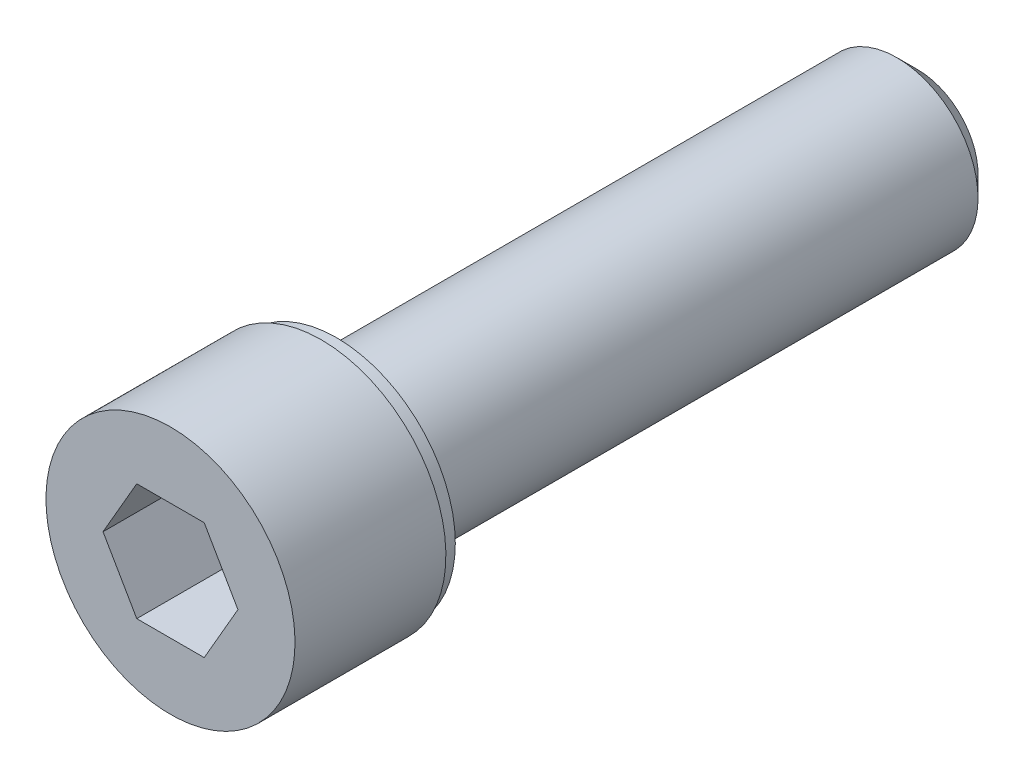
ISO-10303-21;
HEADER;
FILE_DESCRIPTION(('STEP AP214'),'2;1');
FILE_NAME('part.step','',(''),(''),'','','');
FILE_SCHEMA(('AUTOMOTIVE_DESIGN { 1 0 10303 214 1 1 1 1 }'));
ENDSEC;
DATA;
#1=APPLICATION_CONTEXT('core data for automotive mechanical design processes');
#2=APPLICATION_PROTOCOL_DEFINITION('international standard','automotive_design',2000,#1);
#3=PRODUCT_CONTEXT('',#1,'mechanical');
#4=PRODUCT('Part','Part','',(#3));
#5=PRODUCT_RELATED_PRODUCT_CATEGORY('part','',(#4));
#6=PRODUCT_DEFINITION_FORMATION('','',#4);
#7=PRODUCT_DEFINITION_CONTEXT('part definition',#1,'design');
#8=PRODUCT_DEFINITION('design','',#6,#7);
#9=PRODUCT_DEFINITION_SHAPE('','',#8);
#10=(LENGTH_UNIT() NAMED_UNIT(*) SI_UNIT(.MILLI.,.METRE.));
#11=(NAMED_UNIT(*) PLANE_ANGLE_UNIT() SI_UNIT($,.RADIAN.));
#12=(NAMED_UNIT(*) SI_UNIT($,.STERADIAN.) SOLID_ANGLE_UNIT());
#13=UNCERTAINTY_MEASURE_WITH_UNIT(LENGTH_MEASURE(1.E-05),#10,'distance_accuracy_value','');
#14=(GEOMETRIC_REPRESENTATION_CONTEXT(3) GLOBAL_UNCERTAINTY_ASSIGNED_CONTEXT((#13)) GLOBAL_UNIT_ASSIGNED_CONTEXT((#10,
#11,#12)) REPRESENTATION_CONTEXT('',''));
#15=CARTESIAN_POINT('',(0.,0.,0.));
#16=DIRECTION('',(0.,0.,1.));
#17=DIRECTION('',(1.,0.,0.));
#18=AXIS2_PLACEMENT_3D('',#15,#16,#17);
#19=CARTESIAN_POINT('',(0.,0.,0.));
#20=DIRECTION('',(0.,0.,1.));
#21=DIRECTION('',(0.,-1.,0.));
#22=AXIS2_PLACEMENT_3D('',#19,#20,#21);
#23=PLANE('',#22);
#24=DIRECTION('',(-0.5,-0.866025403784439,0.));
#25=VECTOR('',#24,1.);
#26=CARTESIAN_POINT('',(-0.812499999999999,1.40729128114971,0.));
#27=LINE('',#26,#25);
#28=CARTESIAN_POINT('',(-0.812499999999999,1.40729128114971,0.));
#29=VERTEX_POINT('',#28);
#30=CARTESIAN_POINT('',(-1.625,0.,0.));
#31=VERTEX_POINT('',#30);
#32=EDGE_CURVE('E49',#29,#31,#27,.T.);
#33=ORIENTED_EDGE('',*,*,#32,.F.);
#34=DIRECTION('',(-1.,0.,0.));
#35=VECTOR('',#34,1.);
#36=CARTESIAN_POINT('',(0.812499999999999,1.40729128114971,0.));
#37=LINE('',#36,#35);
#38=CARTESIAN_POINT('',(0.812499999999999,1.40729128114971,0.));
#39=VERTEX_POINT('',#38);
#40=EDGE_CURVE('E132',#39,#29,#37,.T.);
#41=ORIENTED_EDGE('',*,*,#40,.F.);
#42=DIRECTION('',(-0.5,0.866025403784439,0.));
#43=VECTOR('',#42,1.);
#44=CARTESIAN_POINT('',(1.625,0.,0.));
#45=LINE('',#44,#43);
#46=CARTESIAN_POINT('',(1.625,0.,0.));
#47=VERTEX_POINT('',#46);
#48=EDGE_CURVE('E130',#47,#39,#45,.T.);
#49=ORIENTED_EDGE('',*,*,#48,.F.);
#50=DIRECTION('',(0.5,0.866025403784439,0.));
#51=VECTOR('',#50,1.);
#52=CARTESIAN_POINT('',(0.8125,-1.40729128114971,0.));
#53=LINE('',#52,#51);
#54=CARTESIAN_POINT('',(0.8125,-1.40729128114971,0.));
#55=VERTEX_POINT('',#54);
#56=EDGE_CURVE('E97',#55,#47,#53,.T.);
#57=ORIENTED_EDGE('',*,*,#56,.F.);
#58=DIRECTION('',(1.,0.,0.));
#59=VECTOR('',#58,1.);
#60=CARTESIAN_POINT('',(-0.812500000000001,-1.40729128114971,0.));
#61=LINE('',#60,#59);
#62=CARTESIAN_POINT('',(-0.812500000000001,-1.40729128114971,0.));
#63=VERTEX_POINT('',#62);
#64=EDGE_CURVE('E126',#63,#55,#61,.T.);
#65=ORIENTED_EDGE('',*,*,#64,.F.);
#66=DIRECTION('',(0.5,-0.866025403784439,0.));
#67=VECTOR('',#66,1.);
#68=CARTESIAN_POINT('',(-1.625,0.,0.));
#69=LINE('',#68,#67);
#70=EDGE_CURVE('E123',#31,#63,#69,.T.);
#71=ORIENTED_EDGE('',*,*,#70,.F.);
#72=EDGE_LOOP('',(#33,#41,#49,#57,#65,#71));
#73=FACE_BOUND('',#72,.T.);
#74=CARTESIAN_POINT('',(0.,0.,0.));
#75=DIRECTION('',(0.,0.,-1.));
#76=DIRECTION('',(0.,1.,0.));
#77=AXIS2_PLACEMENT_3D('',#74,#75,#76);
#78=CIRCLE('',#77,3.00000000000011);
#79=CARTESIAN_POINT('',(0.,3.00000000000011,0.));
#80=VERTEX_POINT('',#79);
#81=EDGE_CURVE('E150',#80,#80,#78,.T.);
#82=ORIENTED_EDGE('',*,*,#81,.F.);
#83=EDGE_LOOP('',(#82));
#84=FACE_BOUND('',#83,.T.);
#85=ADVANCED_FACE('F34',(#73,#84),#23,.T.);
#86=CARTESIAN_POINT('',(0.,0.,-18.));
#87=DIRECTION('',(0.,0.,-1.));
#88=DIRECTION('',(0.,1.,0.));
#89=AXIS2_PLACEMENT_3D('',#86,#87,#88);
#90=CYLINDRICAL_SURFACE('',#89,3.00000000000012);
#91=ORIENTED_EDGE('',*,*,#81,.T.);
#92=EDGE_LOOP('',(#91));
#93=FACE_BOUND('',#92,.T.);
#94=CARTESIAN_POINT('',(0.,0.,-3.63504566037622));
#95=DIRECTION('',(0.,0.,-1.));
#96=DIRECTION('',(0.,1.,0.));
#97=AXIS2_PLACEMENT_3D('',#94,#95,#96);
#98=CIRCLE('',#97,3.00000000000012);
#99=CARTESIAN_POINT('',(0.,3.00000000000011,-3.63504566037623));
#100=VERTEX_POINT('',#99);
#101=EDGE_CURVE('E147',#100,#100,#98,.T.);
#102=ORIENTED_EDGE('',*,*,#101,.F.);
#103=EDGE_LOOP('',(#102));
#104=FACE_BOUND('',#103,.T.);
#105=ADVANCED_FACE('F176',(#93,#104),#90,.T.);
#106=CARTESIAN_POINT('',(0.,3.00000000000011,-3.63504566037623));
#107=DIRECTION('',(0.,0.,-1.));
#108=DIRECTION('',(0.,1.,0.));
#109=AXIS2_PLACEMENT_3D('',#106,#107,#108);
#110=PLANE('',#109);
#111=ORIENTED_EDGE('',*,*,#101,.T.);
#112=EDGE_LOOP('',(#111));
#113=FACE_BOUND('',#112,.T.);
#114=CARTESIAN_POINT('',(0.,0.,-3.63504566037622));
#115=DIRECTION('',(0.,0.,-1.));
#116=DIRECTION('',(0.,1.,0.));
#117=AXIS2_PLACEMENT_3D('',#114,#115,#116);
#118=CIRCLE('',#117,2.86201984461388);
#119=CARTESIAN_POINT('',(0.,2.86201984461387,-3.63504566037623));
#120=VERTEX_POINT('',#119);
#121=EDGE_CURVE('E144',#120,#120,#118,.T.);
#122=ORIENTED_EDGE('',*,*,#121,.F.);
#123=EDGE_LOOP('',(#122));
#124=FACE_BOUND('',#123,.T.);
#125=ADVANCED_FACE('F182',(#113,#124),#110,.T.);
#126=CARTESIAN_POINT('',(0.,0.,-18.));
#127=DIRECTION('',(0.,0.,-1.));
#128=DIRECTION('',(0.,1.,0.));
#129=AXIS2_PLACEMENT_3D('',#126,#127,#128);
#130=CYLINDRICAL_SURFACE('',#129,2.86201984461388);
#131=ORIENTED_EDGE('',*,*,#121,.T.);
#132=EDGE_LOOP('',(#131));
#133=FACE_BOUND('',#132,.T.);
#134=CARTESIAN_POINT('',(0.,0.,-4.00000000000002));
#135=DIRECTION('',(0.,0.,-1.));
#136=DIRECTION('',(0.,1.,0.));
#137=AXIS2_PLACEMENT_3D('',#134,#135,#136);
#138=CIRCLE('',#137,2.86201984461388);
#139=CARTESIAN_POINT('',(0.,2.86201984461387,-4.00000000000002));
#140=VERTEX_POINT('',#139);
#141=EDGE_CURVE('E136',#140,#140,#138,.T.);
#142=ORIENTED_EDGE('',*,*,#141,.F.);
#143=EDGE_LOOP('',(#142));
#144=FACE_BOUND('',#143,.T.);
#145=ADVANCED_FACE('F189',(#133,#144),#130,.T.);
#146=CARTESIAN_POINT('',(0.,2.86201984461387,-4.00000000000002));
#147=DIRECTION('',(0.,0.,-1.));
#148=DIRECTION('',(0.,1.,0.));
#149=AXIS2_PLACEMENT_3D('',#146,#147,#148);
#150=PLANE('',#149);
#151=CARTESIAN_POINT('',(0.,0.,-4.00000000000002));
#152=DIRECTION('',(0.,0.,-1.));
#153=DIRECTION('',(0.,1.,0.));
#154=AXIS2_PLACEMENT_3D('',#151,#152,#153);
#155=CIRCLE('',#154,2.15499999999999);
#156=CARTESIAN_POINT('',(0.,2.15499999999999,-4.00000000000002));
#157=VERTEX_POINT('',#156);
#158=EDGE_CURVE('E156',#157,#157,#155,.F.);
#159=ORIENTED_EDGE('',*,*,#158,.T.);
#160=EDGE_LOOP('',(#159));
#161=FACE_BOUND('',#160,.T.);
#162=ORIENTED_EDGE('',*,*,#141,.T.);
#163=EDGE_LOOP('',(#162));
#164=FACE_BOUND('',#163,.T.);
#165=ADVANCED_FACE('F193',(#161,#164),#150,.T.);
#166=CARTESIAN_POINT('',(0.,0.,-18.));
#167=DIRECTION('',(0.,0.,-1.));
#168=DIRECTION('',(0.,1.,0.));
#169=AXIS2_PLACEMENT_3D('',#166,#167,#168);
#170=CYLINDRICAL_SURFACE('',#169,1.95499999999999);
#171=CARTESIAN_POINT('',(0.,0.,-17.5));
#172=DIRECTION('',(0.,0.,-1.));
#173=DIRECTION('',(0.,1.,0.));
#174=AXIS2_PLACEMENT_3D('',#171,#172,#173);
#175=CIRCLE('',#174,1.95499999999999);
#176=CARTESIAN_POINT('',(0.,1.95499999999997,-17.5));
#177=VERTEX_POINT('',#176);
#178=EDGE_CURVE('E11',#177,#177,#175,.F.);
#179=ORIENTED_EDGE('',*,*,#178,.T.);
#180=EDGE_LOOP('',(#179));
#181=FACE_BOUND('',#180,.T.);
#182=CARTESIAN_POINT('',(0.,0.,-4.20000000000002));
#183=DIRECTION('',(0.,0.,-1.));
#184=DIRECTION('',(0.,1.,0.));
#185=AXIS2_PLACEMENT_3D('',#182,#183,#184);
#186=CIRCLE('',#185,1.95499999999999);
#187=CARTESIAN_POINT('',(0.,1.95499999999999,-4.20000000000002));
#188=VERTEX_POINT('',#187);
#189=EDGE_CURVE('E153',#188,#188,#186,.T.);
#190=ORIENTED_EDGE('',*,*,#189,.T.);
#191=EDGE_LOOP('',(#190));
#192=FACE_BOUND('',#191,.T.);
#193=ADVANCED_FACE('F197',(#181,#192),#170,.T.);
#194=CARTESIAN_POINT('',(0.,1.95499999999998,-18.));
#195=DIRECTION('',(0.,0.,-1.));
#196=DIRECTION('',(0.,1.,0.));
#197=AXIS2_PLACEMENT_3D('',#194,#195,#196);
#198=PLANE('',#197);
#199=CARTESIAN_POINT('',(0.,0.,-18.));
#200=DIRECTION('',(0.,0.,-1.));
#201=DIRECTION('',(0.,1.,0.));
#202=AXIS2_PLACEMENT_3D('',#199,#200,#201);
#203=CIRCLE('',#202,1.455);
#204=CARTESIAN_POINT('',(0.,1.45499999999998,-18.));
#205=VERTEX_POINT('',#204);
#206=EDGE_CURVE('E42',#205,#205,#203,.T.);
#207=ORIENTED_EDGE('',*,*,#206,.T.);
#208=EDGE_LOOP('',(#207));
#209=FACE_BOUND('',#208,.T.);
#210=ADVANCED_FACE('F161',(#209),#198,.T.);
#211=CARTESIAN_POINT('',(0.,0.,-4.20000000000002));
#212=DIRECTION('',(0.,0.,-1.));
#213=DIRECTION('',(0.,1.,0.));
#214=AXIS2_PLACEMENT_3D('',#211,#212,#213);
#215=TOROIDAL_SURFACE('',#214,2.15499999999999,0.2);
#216=ORIENTED_EDGE('',*,*,#158,.F.);
#217=EDGE_LOOP('',(#216));
#218=FACE_BOUND('',#217,.T.);
#219=ORIENTED_EDGE('',*,*,#189,.F.);
#220=EDGE_LOOP('',(#219));
#221=FACE_BOUND('',#220,.T.);
#222=ADVANCED_FACE('F165',(#218,#221),#215,.F.);
#223=CARTESIAN_POINT('',(0.,0.,-18.));
#224=DIRECTION('',(0.,0.,1.));
#225=DIRECTION('',(0.,-1.,0.));
#226=AXIS2_PLACEMENT_3D('',#223,#224,#225);
#227=CONICAL_SURFACE('',#226,1.455,0.785398163397448);
#228=ORIENTED_EDGE('',*,*,#178,.F.);
#229=EDGE_LOOP('',(#228));
#230=FACE_BOUND('',#229,.T.);
#231=ORIENTED_EDGE('',*,*,#206,.F.);
#232=EDGE_LOOP('',(#231));
#233=FACE_BOUND('',#232,.T.);
#234=ADVANCED_FACE('F36',(#230,#233),#227,.T.);
#235=CARTESIAN_POINT('',(-0.812499999999999,1.40729128114971,-2.75));
#236=DIRECTION('',(-0.866025403784439,0.5,0.));
#237=DIRECTION('',(-0.5,-0.866025403784439,0.));
#238=AXIS2_PLACEMENT_3D('',#235,#236,#237);
#239=PLANE('',#238);
#240=ORIENTED_EDGE('',*,*,#32,.T.);
#241=DIRECTION('',(0.,0.,1.));
#242=VECTOR('',#241,1.);
#243=CARTESIAN_POINT('',(-1.625,0.,-2.75));
#244=LINE('',#243,#242);
#245=CARTESIAN_POINT('',(-1.625,0.,-2.75));
#246=VERTEX_POINT('',#245);
#247=EDGE_CURVE('E79',#246,#31,#244,.T.);
#248=ORIENTED_EDGE('',*,*,#247,.F.);
#249=DIRECTION('',(-0.5,-0.866025403784439,0.));
#250=VECTOR('',#249,1.);
#251=CARTESIAN_POINT('',(-0.812499999999999,1.40729128114971,-2.75));
#252=LINE('',#251,#250);
#253=CARTESIAN_POINT('',(-0.812499999999999,1.40729128114971,-2.75));
#254=VERTEX_POINT('',#253);
#255=EDGE_CURVE('E134',#254,#246,#252,.T.);
#256=ORIENTED_EDGE('',*,*,#255,.F.);
#257=DIRECTION('',(0.,0.,1.));
#258=VECTOR('',#257,1.);
#259=CARTESIAN_POINT('',(-0.812499999999999,1.40729128114971,-2.75));
#260=LINE('',#259,#258);
#261=EDGE_CURVE('E57',#254,#29,#260,.T.);
#262=ORIENTED_EDGE('',*,*,#261,.T.);
#263=EDGE_LOOP('',(#240,#248,#256,#262));
#264=FACE_BOUND('',#263,.T.);
#265=ADVANCED_FACE('F164',(#264),#239,.F.);
#266=CARTESIAN_POINT('',(0.812499999999999,1.40729128114971,-2.75));
#267=DIRECTION('',(0.,1.,0.));
#268=DIRECTION('',(-1.,0.,0.));
#269=AXIS2_PLACEMENT_3D('',#266,#267,#268);
#270=PLANE('',#269);
#271=ORIENTED_EDGE('',*,*,#40,.T.);
#272=ORIENTED_EDGE('',*,*,#261,.F.);
#273=DIRECTION('',(-1.,0.,0.));
#274=VECTOR('',#273,1.);
#275=CARTESIAN_POINT('',(0.812499999999999,1.40729128114971,-2.75));
#276=LINE('',#275,#274);
#277=CARTESIAN_POINT('',(0.812499999999999,1.40729128114971,-2.75));
#278=VERTEX_POINT('',#277);
#279=EDGE_CURVE('E109',#278,#254,#276,.T.);
#280=ORIENTED_EDGE('',*,*,#279,.F.);
#281=DIRECTION('',(0.,0.,1.));
#282=VECTOR('',#281,1.);
#283=CARTESIAN_POINT('',(0.812499999999999,1.40729128114971,-2.75));
#284=LINE('',#283,#282);
#285=EDGE_CURVE('E101',#278,#39,#284,.T.);
#286=ORIENTED_EDGE('',*,*,#285,.T.);
#287=EDGE_LOOP('',(#271,#272,#280,#286));
#288=FACE_BOUND('',#287,.T.);
#289=ADVANCED_FACE('F171',(#288),#270,.F.);
#290=CARTESIAN_POINT('',(1.625,0.,-2.75));
#291=DIRECTION('',(0.866025403784439,0.5,0.));
#292=DIRECTION('',(-0.5,0.866025403784439,0.));
#293=AXIS2_PLACEMENT_3D('',#290,#291,#292);
#294=PLANE('',#293);
#295=ORIENTED_EDGE('',*,*,#48,.T.);
#296=ORIENTED_EDGE('',*,*,#285,.F.);
#297=DIRECTION('',(-0.5,0.866025403784439,0.));
#298=VECTOR('',#297,1.);
#299=CARTESIAN_POINT('',(1.625,0.,-2.75));
#300=LINE('',#299,#298);
#301=CARTESIAN_POINT('',(1.625,0.,-2.75));
#302=VERTEX_POINT('',#301);
#303=EDGE_CURVE('E105',#302,#278,#300,.T.);
#304=ORIENTED_EDGE('',*,*,#303,.F.);
#305=DIRECTION('',(0.,0.,1.));
#306=VECTOR('',#305,1.);
#307=CARTESIAN_POINT('',(1.625,0.,-2.75));
#308=LINE('',#307,#306);
#309=EDGE_CURVE('E90',#302,#47,#308,.T.);
#310=ORIENTED_EDGE('',*,*,#309,.T.);
#311=EDGE_LOOP('',(#295,#296,#304,#310));
#312=FACE_BOUND('',#311,.T.);
#313=ADVANCED_FACE('F106',(#312),#294,.F.);
#314=CARTESIAN_POINT('',(0.8125,-1.40729128114971,-2.75));
#315=DIRECTION('',(0.866025403784439,-0.5,0.));
#316=DIRECTION('',(0.5,0.866025403784439,0.));
#317=AXIS2_PLACEMENT_3D('',#314,#315,#316);
#318=PLANE('',#317);
#319=ORIENTED_EDGE('',*,*,#56,.T.);
#320=ORIENTED_EDGE('',*,*,#309,.F.);
#321=DIRECTION('',(0.5,0.866025403784439,0.));
#322=VECTOR('',#321,1.);
#323=CARTESIAN_POINT('',(0.8125,-1.40729128114971,-2.75));
#324=LINE('',#323,#322);
#325=CARTESIAN_POINT('',(0.8125,-1.40729128114971,-2.75));
#326=VERTEX_POINT('',#325);
#327=EDGE_CURVE('E94',#326,#302,#324,.T.);
#328=ORIENTED_EDGE('',*,*,#327,.F.);
#329=DIRECTION('',(0.,0.,1.));
#330=VECTOR('',#329,1.);
#331=CARTESIAN_POINT('',(0.8125,-1.40729128114971,-2.75));
#332=LINE('',#331,#330);
#333=EDGE_CURVE('E102',#326,#55,#332,.T.);
#334=ORIENTED_EDGE('',*,*,#333,.T.);
#335=EDGE_LOOP('',(#319,#320,#328,#334));
#336=FACE_BOUND('',#335,.T.);
#337=ADVANCED_FACE('F92',(#336),#318,.F.);
#338=CARTESIAN_POINT('',(-0.812500000000001,-1.40729128114971,-2.75));
#339=DIRECTION('',(0.,-1.,0.));
#340=DIRECTION('',(1.,0.,0.));
#341=AXIS2_PLACEMENT_3D('',#338,#339,#340);
#342=PLANE('',#341);
#343=ORIENTED_EDGE('',*,*,#64,.T.);
#344=ORIENTED_EDGE('',*,*,#333,.F.);
#345=DIRECTION('',(1.,0.,0.));
#346=VECTOR('',#345,1.);
#347=CARTESIAN_POINT('',(-0.812500000000001,-1.40729128114971,-2.75));
#348=LINE('',#347,#346);
#349=CARTESIAN_POINT('',(-0.812500000000001,-1.40729128114971,-2.75));
#350=VERTEX_POINT('',#349);
#351=EDGE_CURVE('E115',#350,#326,#348,.T.);
#352=ORIENTED_EDGE('',*,*,#351,.F.);
#353=DIRECTION('',(0.,0.,1.));
#354=VECTOR('',#353,1.);
#355=CARTESIAN_POINT('',(-0.812500000000001,-1.40729128114971,-2.75));
#356=LINE('',#355,#354);
#357=EDGE_CURVE('E139',#350,#63,#356,.T.);
#358=ORIENTED_EDGE('',*,*,#357,.T.);
#359=EDGE_LOOP('',(#343,#344,#352,#358));
#360=FACE_BOUND('',#359,.T.);
#361=ADVANCED_FACE('F207',(#360),#342,.F.);
#362=CARTESIAN_POINT('',(-1.625,0.,-2.75));
#363=DIRECTION('',(-0.866025403784439,-0.5,0.));
#364=DIRECTION('',(0.5,-0.866025403784439,0.));
#365=AXIS2_PLACEMENT_3D('',#362,#363,#364);
#366=PLANE('',#365);
#367=ORIENTED_EDGE('',*,*,#70,.T.);
#368=ORIENTED_EDGE('',*,*,#357,.F.);
#369=DIRECTION('',(0.5,-0.866025403784439,0.));
#370=VECTOR('',#369,1.);
#371=CARTESIAN_POINT('',(-1.625,0.,-2.75));
#372=LINE('',#371,#370);
#373=EDGE_CURVE('E117',#246,#350,#372,.T.);
#374=ORIENTED_EDGE('',*,*,#373,.F.);
#375=ORIENTED_EDGE('',*,*,#247,.T.);
#376=EDGE_LOOP('',(#367,#368,#374,#375));
#377=FACE_BOUND('',#376,.T.);
#378=ADVANCED_FACE('F204',(#377),#366,.F.);
#379=CARTESIAN_POINT('',(0.,0.,-2.75));
#380=DIRECTION('',(0.,0.,1.));
#381=DIRECTION('',(1.,0.,0.));
#382=AXIS2_PLACEMENT_3D('',#379,#380,#381);
#383=PLANE('',#382);
#384=ORIENTED_EDGE('',*,*,#255,.T.);
#385=ORIENTED_EDGE('',*,*,#373,.T.);
#386=ORIENTED_EDGE('',*,*,#351,.T.);
#387=ORIENTED_EDGE('',*,*,#327,.T.);
#388=ORIENTED_EDGE('',*,*,#303,.T.);
#389=ORIENTED_EDGE('',*,*,#279,.T.);
#390=EDGE_LOOP('',(#384,#385,#386,#387,#388,#389));
#391=FACE_BOUND('',#390,.T.);
#392=ADVANCED_FACE('F112',(#391),#383,.T.);
#393=CLOSED_SHELL('',(#85,#105,#125,#145,#165,#193,#210,#222,#234,#265,#289,#313,#337,#361,#378,#392));
#394=MANIFOLD_SOLID_BREP('B2',#393);
#395=ADVANCED_BREP_SHAPE_REPRESENTATION('',(#18,#394),#14);
#396=SHAPE_DEFINITION_REPRESENTATION(#9,#395);
ENDSEC;
END-ISO-10303-21;
